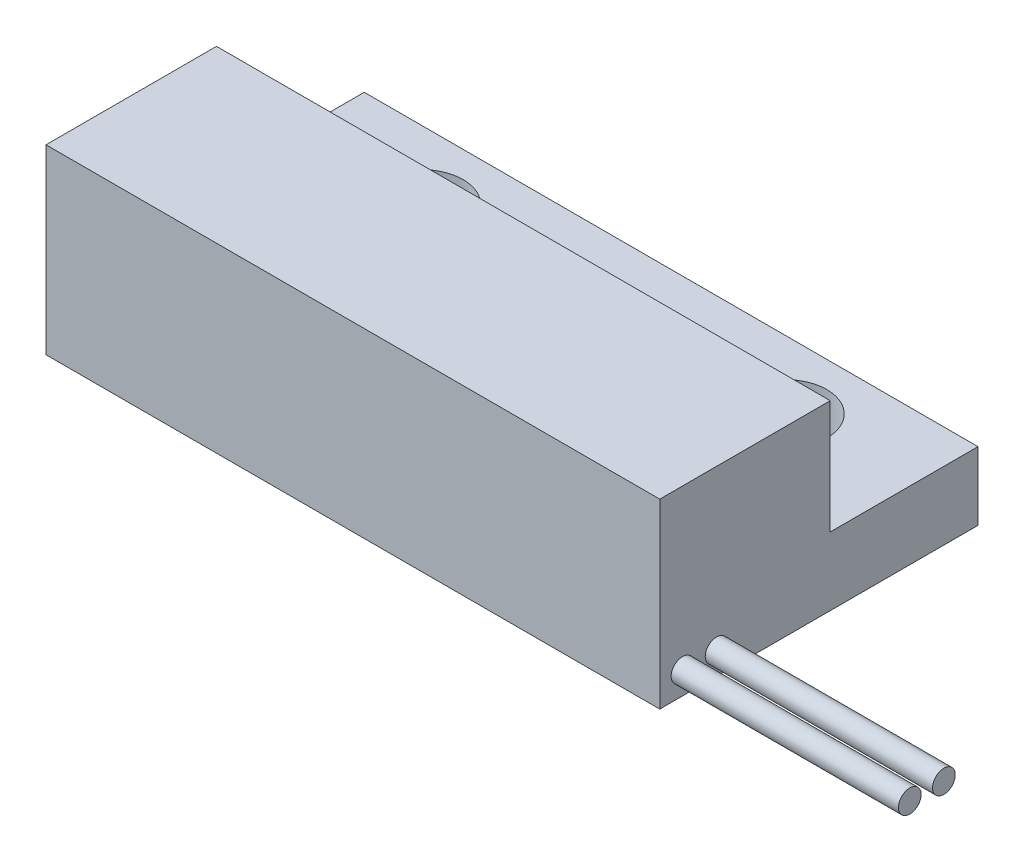
ISO-10303-21;
HEADER;
FILE_DESCRIPTION(('STEP AP214'),'2;1');
FILE_NAME('part.step','',(''),(''),'','','');
FILE_SCHEMA(('AUTOMOTIVE_DESIGN { 1 0 10303 214 1 1 1 1 }'));
ENDSEC;
DATA;
#1=APPLICATION_CONTEXT('core data for automotive mechanical design processes');
#2=APPLICATION_PROTOCOL_DEFINITION('international standard','automotive_design',2000,#1);
#3=PRODUCT_CONTEXT('',#1,'mechanical');
#4=PRODUCT('Part','Part','',(#3));
#5=PRODUCT_RELATED_PRODUCT_CATEGORY('part','',(#4));
#6=PRODUCT_DEFINITION_FORMATION('','',#4);
#7=PRODUCT_DEFINITION_CONTEXT('part definition',#1,'design');
#8=PRODUCT_DEFINITION('design','',#6,#7);
#9=PRODUCT_DEFINITION_SHAPE('','',#8);
#10=(LENGTH_UNIT() NAMED_UNIT(*) SI_UNIT(.MILLI.,.METRE.));
#11=(NAMED_UNIT(*) PLANE_ANGLE_UNIT() SI_UNIT($,.RADIAN.));
#12=(NAMED_UNIT(*) SI_UNIT($,.STERADIAN.) SOLID_ANGLE_UNIT());
#13=UNCERTAINTY_MEASURE_WITH_UNIT(LENGTH_MEASURE(1.E-05),#10,'distance_accuracy_value','');
#14=(GEOMETRIC_REPRESENTATION_CONTEXT(3) GLOBAL_UNCERTAINTY_ASSIGNED_CONTEXT((#13)) GLOBAL_UNIT_ASSIGNED_CONTEXT((#10,
#11,#12)) REPRESENTATION_CONTEXT('',''));
#15=CARTESIAN_POINT('',(0.,0.,0.));
#16=DIRECTION('',(0.,0.,1.));
#17=DIRECTION('',(1.,0.,0.));
#18=AXIS2_PLACEMENT_3D('',#15,#16,#17);
#19=CARTESIAN_POINT('',(0.,8.,0.));
#20=DIRECTION('',(0.,0.,1.));
#21=DIRECTION('',(1.,0.,0.));
#22=AXIS2_PLACEMENT_3D('',#19,#20,#21);
#23=PLANE('',#22);
#24=DIRECTION('',(-1.,0.,0.));
#25=VECTOR('',#24,1.);
#26=CARTESIAN_POINT('',(-27.,3.,0.));
#27=LINE('',#26,#25);
#28=CARTESIAN_POINT('',(0.,3.,0.));
#29=VERTEX_POINT('',#28);
#30=CARTESIAN_POINT('',(-27.,3.,0.));
#31=VERTEX_POINT('',#30);
#32=EDGE_CURVE('E55',#29,#31,#27,.T.);
#33=ORIENTED_EDGE('',*,*,#32,.F.);
#34=DIRECTION('',(0.,-1.,0.));
#35=VECTOR('',#34,1.);
#36=CARTESIAN_POINT('',(0.,8.,0.));
#37=LINE('',#36,#35);
#38=CARTESIAN_POINT('',(0.,0.,0.));
#39=VERTEX_POINT('',#38);
#40=EDGE_CURVE('E129',#29,#39,#37,.T.);
#41=ORIENTED_EDGE('',*,*,#40,.T.);
#42=DIRECTION('',(-1.,0.,0.));
#43=VECTOR('',#42,1.);
#44=CARTESIAN_POINT('',(0.,0.,0.));
#45=LINE('',#44,#43);
#46=CARTESIAN_POINT('',(-27.,0.,0.));
#47=VERTEX_POINT('',#46);
#48=EDGE_CURVE('E109',#39,#47,#45,.T.);
#49=ORIENTED_EDGE('',*,*,#48,.T.);
#50=DIRECTION('',(0.,-1.,0.));
#51=VECTOR('',#50,1.);
#52=CARTESIAN_POINT('',(-27.,8.,0.));
#53=LINE('',#52,#51);
#54=EDGE_CURVE('E126',#31,#47,#53,.T.);
#55=ORIENTED_EDGE('',*,*,#54,.F.);
#56=EDGE_LOOP('',(#33,#41,#49,#55));
#57=FACE_BOUND('',#56,.T.);
#58=ADVANCED_FACE('F39',(#57),#23,.F.);
#59=CARTESIAN_POINT('',(-21.5,8.,3.));
#60=DIRECTION('',(0.,-1.,0.));
#61=DIRECTION('',(0.,0.,-1.));
#62=AXIS2_PLACEMENT_3D('',#59,#60,#61);
#63=CYLINDRICAL_SURFACE('',#62,1.85);
#64=CARTESIAN_POINT('',(-21.5,0.,3.));
#65=DIRECTION('',(0.,1.,0.));
#66=DIRECTION('',(0.,0.,1.));
#67=AXIS2_PLACEMENT_3D('',#64,#65,#66);
#68=CIRCLE('',#67,1.85);
#69=CARTESIAN_POINT('',(-21.5,0.,4.85));
#70=VERTEX_POINT('',#69);
#71=EDGE_CURVE('E111',#70,#70,#68,.T.);
#72=ORIENTED_EDGE('',*,*,#71,.F.);
#73=EDGE_LOOP('',(#72));
#74=FACE_BOUND('',#73,.T.);
#75=CARTESIAN_POINT('',(-21.5,3.,3.));
#76=DIRECTION('',(0.,1.,0.));
#77=DIRECTION('',(0.,0.,1.));
#78=AXIS2_PLACEMENT_3D('',#75,#76,#77);
#79=CIRCLE('',#78,1.85);
#80=CARTESIAN_POINT('',(-21.5,3.,4.85));
#81=VERTEX_POINT('',#80);
#82=EDGE_CURVE('E135',#81,#81,#79,.T.);
#83=ORIENTED_EDGE('',*,*,#82,.T.);
#84=EDGE_LOOP('',(#83));
#85=FACE_BOUND('',#84,.T.);
#86=ADVANCED_FACE('F159',(#74,#85),#63,.F.);
#87=CARTESIAN_POINT('',(-5.5,8.,3.));
#88=DIRECTION('',(0.,-1.,0.));
#89=DIRECTION('',(0.,0.,-1.));
#90=AXIS2_PLACEMENT_3D('',#87,#88,#89);
#91=CYLINDRICAL_SURFACE('',#90,1.85);
#92=CARTESIAN_POINT('',(-5.5,0.,3.));
#93=DIRECTION('',(0.,1.,0.));
#94=DIRECTION('',(0.,0.,-1.));
#95=AXIS2_PLACEMENT_3D('',#92,#93,#94);
#96=CIRCLE('',#95,1.85);
#97=CARTESIAN_POINT('',(-5.5,0.,1.15));
#98=VERTEX_POINT('',#97);
#99=EDGE_CURVE('E117',#98,#98,#96,.T.);
#100=ORIENTED_EDGE('',*,*,#99,.F.);
#101=EDGE_LOOP('',(#100));
#102=FACE_BOUND('',#101,.T.);
#103=CARTESIAN_POINT('',(-5.5,3.,3.));
#104=DIRECTION('',(0.,1.,0.));
#105=DIRECTION('',(0.,0.,1.));
#106=AXIS2_PLACEMENT_3D('',#103,#104,#105);
#107=CIRCLE('',#106,1.85);
#108=CARTESIAN_POINT('',(-5.5,3.,4.85));
#109=VERTEX_POINT('',#108);
#110=EDGE_CURVE('E132',#109,#109,#107,.T.);
#111=ORIENTED_EDGE('',*,*,#110,.T.);
#112=EDGE_LOOP('',(#111));
#113=FACE_BOUND('',#112,.T.);
#114=ADVANCED_FACE('F164',(#102,#113),#91,.F.);
#115=CARTESIAN_POINT('',(0.,8.,0.));
#116=DIRECTION('',(0.,-1.,0.));
#117=DIRECTION('',(0.,0.,-1.));
#118=AXIS2_PLACEMENT_3D('',#115,#116,#117);
#119=PLANE('',#118);
#120=DIRECTION('',(0.,0.,-1.));
#121=VECTOR('',#120,1.);
#122=CARTESIAN_POINT('',(0.,8.,0.));
#123=LINE('',#122,#121);
#124=CARTESIAN_POINT('',(0.,8.,14.));
#125=VERTEX_POINT('',#124);
#126=CARTESIAN_POINT('',(0.,8.,6.5));
#127=VERTEX_POINT('',#126);
#128=EDGE_CURVE('E94',#125,#127,#123,.T.);
#129=ORIENTED_EDGE('',*,*,#128,.T.);
#130=DIRECTION('',(1.,0.,0.));
#131=VECTOR('',#130,1.);
#132=CARTESIAN_POINT('',(-27.,8.,6.5));
#133=LINE('',#132,#131);
#134=CARTESIAN_POINT('',(-27.,8.,6.5));
#135=VERTEX_POINT('',#134);
#136=EDGE_CURVE('E207',#135,#127,#133,.T.);
#137=ORIENTED_EDGE('',*,*,#136,.F.);
#138=DIRECTION('',(0.,0.,1.));
#139=VECTOR('',#138,1.);
#140=CARTESIAN_POINT('',(-27.,8.,0.));
#141=LINE('',#140,#139);
#142=CARTESIAN_POINT('',(-27.,8.,14.));
#143=VERTEX_POINT('',#142);
#144=EDGE_CURVE('E238',#135,#143,#141,.T.);
#145=ORIENTED_EDGE('',*,*,#144,.T.);
#146=DIRECTION('',(1.,0.,0.));
#147=VECTOR('',#146,1.);
#148=CARTESIAN_POINT('',(0.,8.,14.));
#149=LINE('',#148,#147);
#150=EDGE_CURVE('E64',#143,#125,#149,.T.);
#151=ORIENTED_EDGE('',*,*,#150,.T.);
#152=EDGE_LOOP('',(#129,#137,#145,#151));
#153=FACE_BOUND('',#152,.T.);
#154=ADVANCED_FACE('F154',(#153),#119,.F.);
#155=CARTESIAN_POINT('',(0.,0.,0.));
#156=DIRECTION('',(0.,-1.,0.));
#157=DIRECTION('',(0.,0.,-1.));
#158=AXIS2_PLACEMENT_3D('',#155,#156,#157);
#159=PLANE('',#158);
#160=ORIENTED_EDGE('',*,*,#71,.T.);
#161=EDGE_LOOP('',(#160));
#162=FACE_BOUND('',#161,.T.);
#163=DIRECTION('',(0.,0.,-1.));
#164=VECTOR('',#163,1.);
#165=CARTESIAN_POINT('',(0.,0.,0.));
#166=LINE('',#165,#164);
#167=CARTESIAN_POINT('',(0.,0.,14.));
#168=VERTEX_POINT('',#167);
#169=EDGE_CURVE('E101',#168,#39,#166,.T.);
#170=ORIENTED_EDGE('',*,*,#169,.F.);
#171=DIRECTION('',(1.,0.,0.));
#172=VECTOR('',#171,1.);
#173=CARTESIAN_POINT('',(0.,0.,14.));
#174=LINE('',#173,#172);
#175=CARTESIAN_POINT('',(-27.,0.,14.));
#176=VERTEX_POINT('',#175);
#177=EDGE_CURVE('E83',#176,#168,#174,.T.);
#178=ORIENTED_EDGE('',*,*,#177,.F.);
#179=DIRECTION('',(0.,0.,1.));
#180=VECTOR('',#179,1.);
#181=CARTESIAN_POINT('',(-27.,0.,0.));
#182=LINE('',#181,#180);
#183=EDGE_CURVE('E95',#47,#176,#182,.T.);
#184=ORIENTED_EDGE('',*,*,#183,.F.);
#185=ORIENTED_EDGE('',*,*,#48,.F.);
#186=EDGE_LOOP('',(#170,#178,#184,#185));
#187=FACE_BOUND('',#186,.T.);
#188=ORIENTED_EDGE('',*,*,#99,.T.);
#189=EDGE_LOOP('',(#188));
#190=FACE_BOUND('',#189,.T.);
#191=ADVANCED_FACE('F106',(#162,#187,#190),#159,.T.);
#192=CARTESIAN_POINT('',(0.,8.,0.));
#193=DIRECTION('',(-1.,0.,0.));
#194=DIRECTION('',(0.,0.,1.));
#195=AXIS2_PLACEMENT_3D('',#192,#193,#194);
#196=PLANE('',#195);
#197=CARTESIAN_POINT('',(0.,1.,11.5));
#198=DIRECTION('',(-1.,0.,0.));
#199=DIRECTION('',(0.,0.,1.));
#200=AXIS2_PLACEMENT_3D('',#197,#198,#199);
#201=CIRCLE('',#200,0.499999999999999);
#202=CARTESIAN_POINT('',(0.,1.,12.));
#203=VERTEX_POINT('',#202);
#204=EDGE_CURVE('E11',#203,#203,#201,.F.);
#205=ORIENTED_EDGE('',*,*,#204,.F.);
#206=EDGE_LOOP('',(#205));
#207=FACE_BOUND('',#206,.T.);
#208=CARTESIAN_POINT('',(0.,1.,13.));
#209=DIRECTION('',(-1.,0.,0.));
#210=DIRECTION('',(0.,0.,1.));
#211=AXIS2_PLACEMENT_3D('',#208,#209,#210);
#212=CIRCLE('',#211,0.500000000000001);
#213=CARTESIAN_POINT('',(0.,1.,13.5));
#214=VERTEX_POINT('',#213);
#215=EDGE_CURVE('E48',#214,#214,#212,.F.);
#216=ORIENTED_EDGE('',*,*,#215,.F.);
#217=EDGE_LOOP('',(#216));
#218=FACE_BOUND('',#217,.T.);
#219=DIRECTION('',(0.,0.,-1.));
#220=VECTOR('',#219,1.);
#221=CARTESIAN_POINT('',(0.,3.,0.));
#222=LINE('',#221,#220);
#223=CARTESIAN_POINT('',(0.,3.,6.5));
#224=VERTEX_POINT('',#223);
#225=EDGE_CURVE('E217',#224,#29,#222,.T.);
#226=ORIENTED_EDGE('',*,*,#225,.F.);
#227=DIRECTION('',(0.,1.,0.));
#228=VECTOR('',#227,1.);
#229=CARTESIAN_POINT('',(0.,3.,6.5));
#230=LINE('',#229,#228);
#231=EDGE_CURVE('E136',#224,#127,#230,.T.);
#232=ORIENTED_EDGE('',*,*,#231,.T.);
#233=ORIENTED_EDGE('',*,*,#128,.F.);
#234=DIRECTION('',(0.,-1.,0.));
#235=VECTOR('',#234,1.);
#236=CARTESIAN_POINT('',(0.,8.,14.));
#237=LINE('',#236,#235);
#238=EDGE_CURVE('E86',#125,#168,#237,.T.);
#239=ORIENTED_EDGE('',*,*,#238,.T.);
#240=ORIENTED_EDGE('',*,*,#169,.T.);
#241=ORIENTED_EDGE('',*,*,#40,.F.);
#242=EDGE_LOOP('',(#226,#232,#233,#239,#240,#241));
#243=FACE_BOUND('',#242,.T.);
#244=ADVANCED_FACE('F41',(#207,#218,#243),#196,.F.);
#245=CARTESIAN_POINT('',(-27.,8.,0.));
#246=DIRECTION('',(1.,0.,0.));
#247=DIRECTION('',(0.,0.,-1.));
#248=AXIS2_PLACEMENT_3D('',#245,#246,#247);
#249=PLANE('',#248);
#250=ORIENTED_EDGE('',*,*,#144,.F.);
#251=DIRECTION('',(0.,1.,0.));
#252=VECTOR('',#251,1.);
#253=CARTESIAN_POINT('',(-27.,3.,6.5));
#254=LINE('',#253,#252);
#255=CARTESIAN_POINT('',(-27.,3.,6.5));
#256=VERTEX_POINT('',#255);
#257=EDGE_CURVE('E222',#256,#135,#254,.T.);
#258=ORIENTED_EDGE('',*,*,#257,.F.);
#259=DIRECTION('',(0.,0.,1.));
#260=VECTOR('',#259,1.);
#261=CARTESIAN_POINT('',(-27.,3.,0.));
#262=LINE('',#261,#260);
#263=EDGE_CURVE('E210',#31,#256,#262,.T.);
#264=ORIENTED_EDGE('',*,*,#263,.F.);
#265=ORIENTED_EDGE('',*,*,#54,.T.);
#266=ORIENTED_EDGE('',*,*,#183,.T.);
#267=DIRECTION('',(0.,-1.,0.));
#268=VECTOR('',#267,1.);
#269=CARTESIAN_POINT('',(-27.,8.,14.));
#270=LINE('',#269,#268);
#271=EDGE_CURVE('E89',#143,#176,#270,.T.);
#272=ORIENTED_EDGE('',*,*,#271,.F.);
#273=EDGE_LOOP('',(#250,#258,#264,#265,#266,#272));
#274=FACE_BOUND('',#273,.T.);
#275=ADVANCED_FACE('F144',(#274),#249,.F.);
#276=CARTESIAN_POINT('',(0.,8.,14.));
#277=DIRECTION('',(0.,0.,-1.));
#278=DIRECTION('',(-1.,0.,0.));
#279=AXIS2_PLACEMENT_3D('',#276,#277,#278);
#280=PLANE('',#279);
#281=ORIENTED_EDGE('',*,*,#177,.T.);
#282=ORIENTED_EDGE('',*,*,#238,.F.);
#283=ORIENTED_EDGE('',*,*,#150,.F.);
#284=ORIENTED_EDGE('',*,*,#271,.T.);
#285=EDGE_LOOP('',(#281,#282,#283,#284));
#286=FACE_BOUND('',#285,.T.);
#287=ADVANCED_FACE('F85',(#286),#280,.F.);
#288=CARTESIAN_POINT('',(-27.,3.,6.5));
#289=DIRECTION('',(0.,0.,1.));
#290=DIRECTION('',(1.,0.,0.));
#291=AXIS2_PLACEMENT_3D('',#288,#289,#290);
#292=PLANE('',#291);
#293=ORIENTED_EDGE('',*,*,#136,.T.);
#294=ORIENTED_EDGE('',*,*,#231,.F.);
#295=DIRECTION('',(1.,0.,0.));
#296=VECTOR('',#295,1.);
#297=CARTESIAN_POINT('',(-27.,3.,6.5));
#298=LINE('',#297,#296);
#299=EDGE_CURVE('E213',#256,#224,#298,.T.);
#300=ORIENTED_EDGE('',*,*,#299,.F.);
#301=ORIENTED_EDGE('',*,*,#257,.T.);
#302=EDGE_LOOP('',(#293,#294,#300,#301));
#303=FACE_BOUND('',#302,.T.);
#304=ADVANCED_FACE('F169',(#303),#292,.F.);
#305=CARTESIAN_POINT('',(0.,3.,0.));
#306=DIRECTION('',(0.,1.,0.));
#307=DIRECTION('',(0.,0.,1.));
#308=AXIS2_PLACEMENT_3D('',#305,#306,#307);
#309=PLANE('',#308);
#310=ORIENTED_EDGE('',*,*,#82,.F.);
#311=EDGE_LOOP('',(#310));
#312=FACE_BOUND('',#311,.T.);
#313=ORIENTED_EDGE('',*,*,#110,.F.);
#314=EDGE_LOOP('',(#313));
#315=FACE_BOUND('',#314,.T.);
#316=ORIENTED_EDGE('',*,*,#263,.T.);
#317=ORIENTED_EDGE('',*,*,#299,.T.);
#318=ORIENTED_EDGE('',*,*,#225,.T.);
#319=ORIENTED_EDGE('',*,*,#32,.T.);
#320=EDGE_LOOP('',(#316,#317,#318,#319));
#321=FACE_BOUND('',#320,.T.);
#322=ADVANCED_FACE('F178',(#312,#315,#321),#309,.T.);
#323=CARTESIAN_POINT('',(10.,1.,13.));
#324=DIRECTION('',(-1.,0.,0.));
#325=DIRECTION('',(0.,0.,1.));
#326=AXIS2_PLACEMENT_3D('',#323,#324,#325);
#327=CYLINDRICAL_SURFACE('',#326,0.500000000000001);
#328=CARTESIAN_POINT('',(10.,1.,13.));
#329=DIRECTION('',(1.,0.,0.));
#330=DIRECTION('',(0.,0.,-1.));
#331=AXIS2_PLACEMENT_3D('',#328,#329,#330);
#332=CIRCLE('',#331,0.500000000000001);
#333=CARTESIAN_POINT('',(10.,1.,12.5));
#334=VERTEX_POINT('',#333);
#335=EDGE_CURVE('E203',#334,#334,#332,.T.);
#336=ORIENTED_EDGE('',*,*,#335,.F.);
#337=EDGE_LOOP('',(#336));
#338=FACE_BOUND('',#337,.T.);
#339=ORIENTED_EDGE('',*,*,#215,.T.);
#340=EDGE_LOOP('',(#339));
#341=FACE_BOUND('',#340,.T.);
#342=ADVANCED_FACE('F141',(#338,#341),#327,.T.);
#343=CARTESIAN_POINT('',(10.,1.,13.));
#344=DIRECTION('',(1.,0.,0.));
#345=DIRECTION('',(0.,0.,-1.));
#346=AXIS2_PLACEMENT_3D('',#343,#344,#345);
#347=PLANE('',#346);
#348=ORIENTED_EDGE('',*,*,#335,.T.);
#349=EDGE_LOOP('',(#348));
#350=FACE_BOUND('',#349,.T.);
#351=ADVANCED_FACE('F185',(#350),#347,.T.);
#352=CARTESIAN_POINT('',(10.,1.,11.5));
#353=DIRECTION('',(-1.,0.,0.));
#354=DIRECTION('',(0.,0.,1.));
#355=AXIS2_PLACEMENT_3D('',#352,#353,#354);
#356=CYLINDRICAL_SURFACE('',#355,0.499999999999999);
#357=CARTESIAN_POINT('',(10.,1.,11.5));
#358=DIRECTION('',(1.,0.,0.));
#359=DIRECTION('',(0.,0.,1.));
#360=AXIS2_PLACEMENT_3D('',#357,#358,#359);
#361=CIRCLE('',#360,0.499999999999999);
#362=CARTESIAN_POINT('',(10.,1.,12.));
#363=VERTEX_POINT('',#362);
#364=EDGE_CURVE('E201',#363,#363,#361,.T.);
#365=ORIENTED_EDGE('',*,*,#364,.F.);
#366=EDGE_LOOP('',(#365));
#367=FACE_BOUND('',#366,.T.);
#368=ORIENTED_EDGE('',*,*,#204,.T.);
#369=EDGE_LOOP('',(#368));
#370=FACE_BOUND('',#369,.T.);
#371=ADVANCED_FACE('F189',(#367,#370),#356,.T.);
#372=CARTESIAN_POINT('',(10.,1.,11.5));
#373=DIRECTION('',(-1.,0.,0.));
#374=DIRECTION('',(0.,0.,1.));
#375=AXIS2_PLACEMENT_3D('',#372,#373,#374);
#376=PLANE('',#375);
#377=ORIENTED_EDGE('',*,*,#364,.T.);
#378=EDGE_LOOP('',(#377));
#379=FACE_BOUND('',#378,.T.);
#380=ADVANCED_FACE('F193',(#379),#376,.F.);
#381=CLOSED_SHELL('',(#58,#86,#114,#154,#191,#244,#275,#287,#304,#322,#342,#351,#371,#380));
#382=MANIFOLD_SOLID_BREP('B2',#381);
#383=ADVANCED_BREP_SHAPE_REPRESENTATION('',(#18,#382),#14);
#384=SHAPE_DEFINITION_REPRESENTATION(#9,#383);
ENDSEC;
END-ISO-10303-21;
